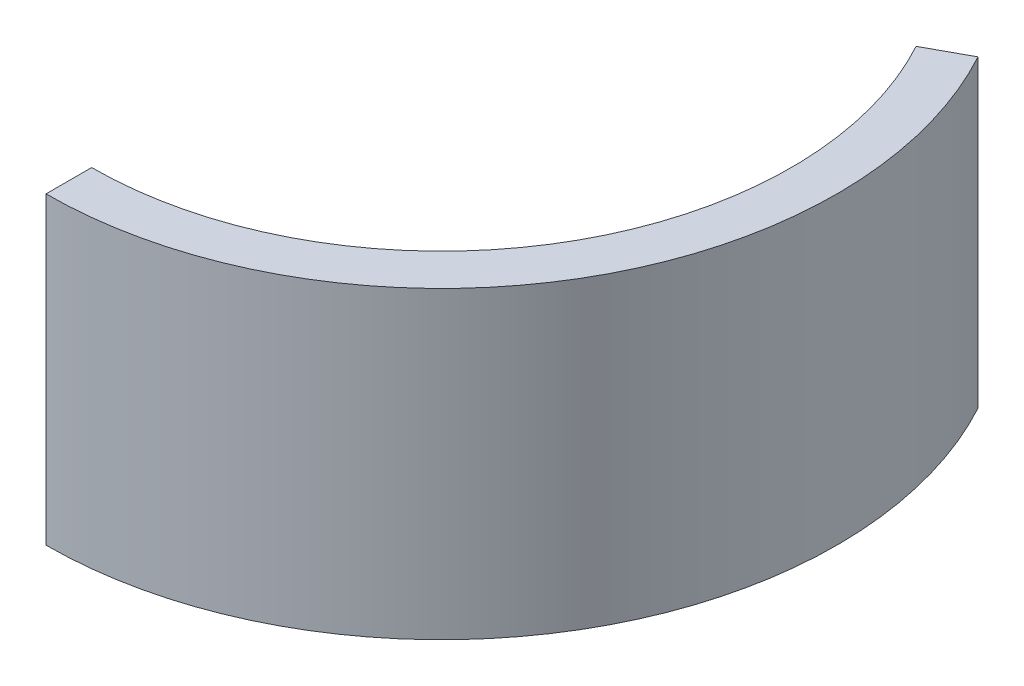
ISO-10303-21;
HEADER;
FILE_DESCRIPTION(('STEP AP214'),'2;1');
FILE_NAME('part.step','',(''),(''),'','','');
FILE_SCHEMA(('AUTOMOTIVE_DESIGN { 1 0 10303 214 1 1 1 1 }'));
ENDSEC;
DATA;
#1=APPLICATION_CONTEXT('core data for automotive mechanical design processes');
#2=APPLICATION_PROTOCOL_DEFINITION('international standard','automotive_design',2000,#1);
#3=PRODUCT_CONTEXT('',#1,'mechanical');
#4=PRODUCT('Part','Part','',(#3));
#5=PRODUCT_RELATED_PRODUCT_CATEGORY('part','',(#4));
#6=PRODUCT_DEFINITION_FORMATION('','',#4);
#7=PRODUCT_DEFINITION_CONTEXT('part definition',#1,'design');
#8=PRODUCT_DEFINITION('design','',#6,#7);
#9=PRODUCT_DEFINITION_SHAPE('','',#8);
#10=(LENGTH_UNIT() NAMED_UNIT(*) SI_UNIT(.MILLI.,.METRE.));
#11=(NAMED_UNIT(*) PLANE_ANGLE_UNIT() SI_UNIT($,.RADIAN.));
#12=(NAMED_UNIT(*) SI_UNIT($,.STERADIAN.) SOLID_ANGLE_UNIT());
#13=UNCERTAINTY_MEASURE_WITH_UNIT(LENGTH_MEASURE(1.E-05),#10,'distance_accuracy_value','');
#14=(GEOMETRIC_REPRESENTATION_CONTEXT(3) GLOBAL_UNCERTAINTY_ASSIGNED_CONTEXT((#13)) GLOBAL_UNIT_ASSIGNED_CONTEXT((#10,
#11,#12)) REPRESENTATION_CONTEXT('',''));
#15=CARTESIAN_POINT('',(0.,0.,0.));
#16=DIRECTION('',(0.,0.,1.));
#17=DIRECTION('',(1.,0.,0.));
#18=AXIS2_PLACEMENT_3D('',#15,#16,#17);
#19=CARTESIAN_POINT('',(0.,20.,0.));
#20=DIRECTION('',(1.,0.,0.));
#21=DIRECTION('',(0.,0.,-1.));
#22=AXIS2_PLACEMENT_3D('',#19,#20,#21);
#23=PLANE('',#22);
#24=DIRECTION('',(0.,0.,1.));
#25=VECTOR('',#24,1.);
#26=CARTESIAN_POINT('',(0.,0.,0.));
#27=LINE('',#26,#25);
#28=CARTESIAN_POINT('',(0.,0.,23.));
#29=VERTEX_POINT('',#28);
#30=CARTESIAN_POINT('',(0.,0.,26.));
#31=VERTEX_POINT('',#30);
#32=EDGE_CURVE('E112',#29,#31,#27,.T.);
#33=ORIENTED_EDGE('',*,*,#32,.T.);
#34=DIRECTION('',(0.,-1.,0.));
#35=VECTOR('',#34,1.);
#36=CARTESIAN_POINT('',(0.,20.,26.));
#37=LINE('',#36,#35);
#38=CARTESIAN_POINT('',(0.,20.,26.));
#39=VERTEX_POINT('',#38);
#40=EDGE_CURVE('E11',#39,#31,#37,.T.);
#41=ORIENTED_EDGE('',*,*,#40,.F.);
#42=DIRECTION('',(0.,0.,1.));
#43=VECTOR('',#42,1.);
#44=CARTESIAN_POINT('',(0.,20.,0.));
#45=LINE('',#44,#43);
#46=CARTESIAN_POINT('',(0.,20.,23.));
#47=VERTEX_POINT('',#46);
#48=EDGE_CURVE('E93',#47,#39,#45,.T.);
#49=ORIENTED_EDGE('',*,*,#48,.F.);
#50=DIRECTION('',(0.,-1.,0.));
#51=VECTOR('',#50,1.);
#52=CARTESIAN_POINT('',(0.,20.,23.));
#53=LINE('',#52,#51);
#54=EDGE_CURVE('E108',#47,#29,#53,.T.);
#55=ORIENTED_EDGE('',*,*,#54,.T.);
#56=EDGE_LOOP('',(#33,#41,#49,#55));
#57=FACE_BOUND('',#56,.T.);
#58=ADVANCED_FACE('F45',(#57),#23,.F.);
#59=CARTESIAN_POINT('',(0.,20.,0.));
#60=DIRECTION('',(0.,-1.,0.));
#61=DIRECTION('',(0.,0.,-1.));
#62=AXIS2_PLACEMENT_3D('',#59,#60,#61);
#63=CYLINDRICAL_SURFACE('',#62,26.);
#64=CARTESIAN_POINT('',(0.,0.,0.));
#65=DIRECTION('',(0.,1.,0.));
#66=DIRECTION('',(0.,0.,1.));
#67=AXIS2_PLACEMENT_3D('',#64,#65,#66);
#68=CIRCLE('',#67,26.);
#69=CARTESIAN_POINT('',(22.8336633389056,0.,-12.4347826086957));
#70=VERTEX_POINT('',#69);
#71=EDGE_CURVE('E99',#31,#70,#68,.T.);
#72=ORIENTED_EDGE('',*,*,#71,.T.);
#73=DIRECTION('',(0.,-1.,0.));
#74=VECTOR('',#73,1.);
#75=CARTESIAN_POINT('',(22.8336633389056,20.,-12.4347826086957));
#76=LINE('',#75,#74);
#77=CARTESIAN_POINT('',(22.8336633389056,20.,-12.4347826086957));
#78=VERTEX_POINT('',#77);
#79=EDGE_CURVE('E54',#78,#70,#76,.T.);
#80=ORIENTED_EDGE('',*,*,#79,.F.);
#81=CARTESIAN_POINT('',(0.,20.,0.));
#82=DIRECTION('',(0.,1.,0.));
#83=DIRECTION('',(0.,0.,1.));
#84=AXIS2_PLACEMENT_3D('',#81,#82,#83);
#85=CIRCLE('',#84,26.);
#86=EDGE_CURVE('E88',#39,#78,#85,.T.);
#87=ORIENTED_EDGE('',*,*,#86,.F.);
#88=ORIENTED_EDGE('',*,*,#40,.T.);
#89=EDGE_LOOP('',(#72,#80,#87,#88));
#90=FACE_BOUND('',#89,.T.);
#91=ADVANCED_FACE('F98',(#90),#63,.T.);
#92=CARTESIAN_POINT('',(0.,20.,0.));
#93=DIRECTION('',(-0.478260869565218,0.,-0.878217820727137));
#94=DIRECTION('',(-0.878217820727137,0.,0.478260869565218));
#95=AXIS2_PLACEMENT_3D('',#92,#93,#94);
#96=PLANE('',#95);
#97=DIRECTION('',(0.878217820727137,0.,-0.478260869565218));
#98=VECTOR('',#97,1.);
#99=CARTESIAN_POINT('',(0.,0.,0.));
#100=LINE('',#99,#98);
#101=CARTESIAN_POINT('',(20.1990098767242,0.,-11.));
#102=VERTEX_POINT('',#101);
#103=EDGE_CURVE('E118',#102,#70,#100,.T.);
#104=ORIENTED_EDGE('',*,*,#103,.F.);
#105=DIRECTION('',(0.,-1.,0.));
#106=VECTOR('',#105,1.);
#107=CARTESIAN_POINT('',(20.1990098767242,20.,-11.));
#108=LINE('',#107,#106);
#109=CARTESIAN_POINT('',(20.1990098767242,20.,-11.));
#110=VERTEX_POINT('',#109);
#111=EDGE_CURVE('E78',#110,#102,#108,.T.);
#112=ORIENTED_EDGE('',*,*,#111,.F.);
#113=DIRECTION('',(0.878217820727137,0.,-0.478260869565218));
#114=VECTOR('',#113,1.);
#115=CARTESIAN_POINT('',(0.,20.,0.));
#116=LINE('',#115,#114);
#117=EDGE_CURVE('E91',#110,#78,#116,.T.);
#118=ORIENTED_EDGE('',*,*,#117,.T.);
#119=ORIENTED_EDGE('',*,*,#79,.T.);
#120=EDGE_LOOP('',(#104,#112,#118,#119));
#121=FACE_BOUND('',#120,.T.);
#122=ADVANCED_FACE('F104',(#121),#96,.T.);
#123=CARTESIAN_POINT('',(0.,20.,0.));
#124=DIRECTION('',(0.,-1.,0.));
#125=DIRECTION('',(0.,0.,-1.));
#126=AXIS2_PLACEMENT_3D('',#123,#124,#125);
#127=CYLINDRICAL_SURFACE('',#126,23.);
#128=CARTESIAN_POINT('',(0.,0.,0.));
#129=DIRECTION('',(0.,1.,0.));
#130=DIRECTION('',(0.,0.,1.));
#131=AXIS2_PLACEMENT_3D('',#128,#129,#130);
#132=CIRCLE('',#131,23.);
#133=EDGE_CURVE('E81',#102,#29,#132,.F.);
#134=ORIENTED_EDGE('',*,*,#133,.T.);
#135=ORIENTED_EDGE('',*,*,#54,.F.);
#136=CARTESIAN_POINT('',(0.,20.,0.));
#137=DIRECTION('',(0.,1.,0.));
#138=DIRECTION('',(0.,0.,1.));
#139=AXIS2_PLACEMENT_3D('',#136,#137,#138);
#140=CIRCLE('',#139,23.);
#141=EDGE_CURVE('E62',#110,#47,#140,.F.);
#142=ORIENTED_EDGE('',*,*,#141,.F.);
#143=ORIENTED_EDGE('',*,*,#111,.T.);
#144=EDGE_LOOP('',(#134,#135,#142,#143));
#145=FACE_BOUND('',#144,.T.);
#146=ADVANCED_FACE('F135',(#145),#127,.F.);
#147=CARTESIAN_POINT('',(0.,20.,0.));
#148=DIRECTION('',(0.,1.,0.));
#149=DIRECTION('',(0.,0.,1.));
#150=AXIS2_PLACEMENT_3D('',#147,#148,#149);
#151=PLANE('',#150);
#152=ORIENTED_EDGE('',*,*,#48,.T.);
#153=ORIENTED_EDGE('',*,*,#86,.T.);
#154=ORIENTED_EDGE('',*,*,#117,.F.);
#155=ORIENTED_EDGE('',*,*,#141,.T.);
#156=EDGE_LOOP('',(#152,#153,#154,#155));
#157=FACE_BOUND('',#156,.T.);
#158=ADVANCED_FACE('F89',(#157),#151,.T.);
#159=CARTESIAN_POINT('',(0.,0.,0.));
#160=DIRECTION('',(0.,1.,0.));
#161=DIRECTION('',(0.,0.,1.));
#162=AXIS2_PLACEMENT_3D('',#159,#160,#161);
#163=PLANE('',#162);
#164=ORIENTED_EDGE('',*,*,#32,.F.);
#165=ORIENTED_EDGE('',*,*,#133,.F.);
#166=ORIENTED_EDGE('',*,*,#103,.T.);
#167=ORIENTED_EDGE('',*,*,#71,.F.);
#168=EDGE_LOOP('',(#164,#165,#166,#167));
#169=FACE_BOUND('',#168,.T.);
#170=ADVANCED_FACE('F129',(#169),#163,.F.);
#171=CLOSED_SHELL('',(#58,#91,#122,#146,#158,#170));
#172=MANIFOLD_SOLID_BREP('B2',#171);
#173=ADVANCED_BREP_SHAPE_REPRESENTATION('',(#18,#172),#14);
#174=SHAPE_DEFINITION_REPRESENTATION(#9,#173);
ENDSEC;
END-ISO-10303-21;
